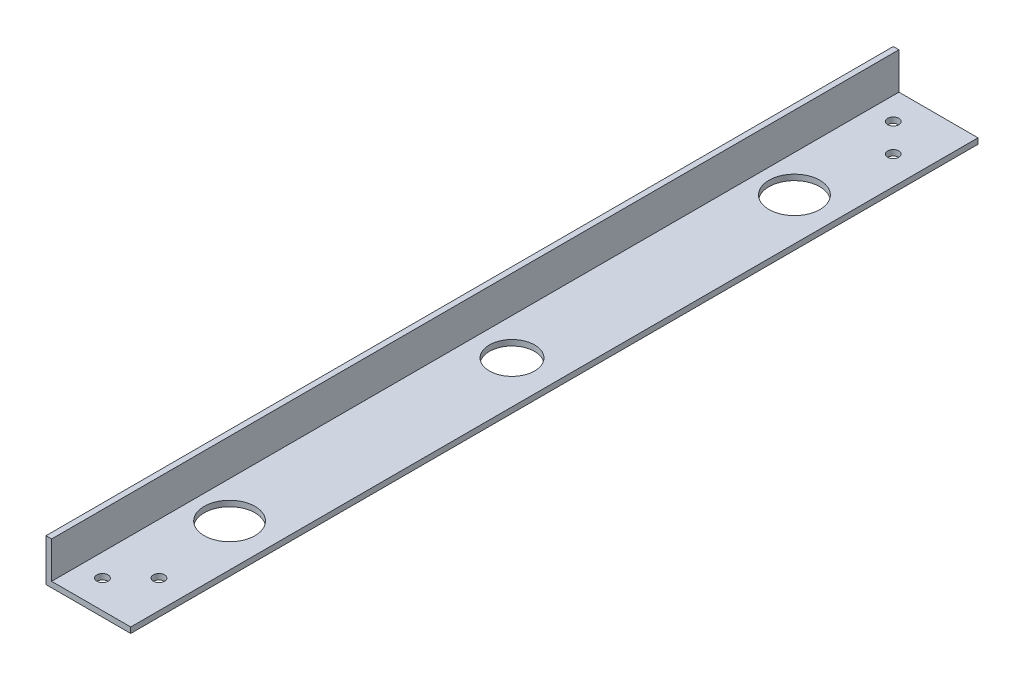
ISO-10303-21;
HEADER;
FILE_DESCRIPTION(('STEP AP214'),'2;1');
FILE_NAME('part.step','',(''),(''),'','','');
FILE_SCHEMA(('AUTOMOTIVE_DESIGN { 1 0 10303 214 1 1 1 1 }'));
ENDSEC;
DATA;
#1=APPLICATION_CONTEXT('core data for automotive mechanical design processes');
#2=APPLICATION_PROTOCOL_DEFINITION('international standard','automotive_design',2000,#1);
#3=PRODUCT_CONTEXT('',#1,'mechanical');
#4=PRODUCT('Part','Part','',(#3));
#5=PRODUCT_RELATED_PRODUCT_CATEGORY('part','',(#4));
#6=PRODUCT_DEFINITION_FORMATION('','',#4);
#7=PRODUCT_DEFINITION_CONTEXT('part definition',#1,'design');
#8=PRODUCT_DEFINITION('design','',#6,#7);
#9=PRODUCT_DEFINITION_SHAPE('','',#8);
#10=(LENGTH_UNIT() NAMED_UNIT(*) SI_UNIT(.MILLI.,.METRE.));
#11=(NAMED_UNIT(*) PLANE_ANGLE_UNIT() SI_UNIT($,.RADIAN.));
#12=(NAMED_UNIT(*) SI_UNIT($,.STERADIAN.) SOLID_ANGLE_UNIT());
#13=UNCERTAINTY_MEASURE_WITH_UNIT(LENGTH_MEASURE(1.E-05),#10,'distance_accuracy_value','');
#14=(GEOMETRIC_REPRESENTATION_CONTEXT(3) GLOBAL_UNCERTAINTY_ASSIGNED_CONTEXT((#13)) GLOBAL_UNIT_ASSIGNED_CONTEXT((#10,
#11,#12)) REPRESENTATION_CONTEXT('',''));
#15=CARTESIAN_POINT('',(0.,0.,0.));
#16=DIRECTION('',(0.,0.,1.));
#17=DIRECTION('',(1.,0.,0.));
#18=AXIS2_PLACEMENT_3D('',#15,#16,#17);
#19=CARTESIAN_POINT('',(30.,0.,300.));
#20=DIRECTION('',(0.,1.,0.));
#21=DIRECTION('',(-1.,0.,0.));
#22=AXIS2_PLACEMENT_3D('',#19,#20,#21);
#23=PLANE('',#22);
#24=CARTESIAN_POINT('',(14.999999999986,0.,50.0000000000007));
#25=DIRECTION('',(0.,-1.,0.));
#26=DIRECTION('',(1.,0.,0.));
#27=AXIS2_PLACEMENT_3D('',#24,#25,#26);
#28=CIRCLE('',#27,9.);
#29=CARTESIAN_POINT('',(23.999999999986,0.,50.0000000000007));
#30=VERTEX_POINT('',#29);
#31=EDGE_CURVE('E145',#30,#30,#28,.T.);
#32=ORIENTED_EDGE('',*,*,#31,.F.);
#33=EDGE_LOOP('',(#32));
#34=FACE_BOUND('',#33,.T.);
#35=CARTESIAN_POINT('',(14.9999999999838,0.,249.999999999999));
#36=DIRECTION('',(0.,-1.,0.));
#37=DIRECTION('',(1.,0.,0.));
#38=AXIS2_PLACEMENT_3D('',#35,#36,#37);
#39=CIRCLE('',#38,9.00000000000001);
#40=CARTESIAN_POINT('',(23.9999999999838,0.,249.999999999999));
#41=VERTEX_POINT('',#40);
#42=EDGE_CURVE('E137',#41,#41,#39,.T.);
#43=ORIENTED_EDGE('',*,*,#42,.F.);
#44=EDGE_LOOP('',(#43));
#45=FACE_BOUND('',#44,.T.);
#46=CARTESIAN_POINT('',(20.,0.,280.));
#47=DIRECTION('',(0.,1.,0.));
#48=DIRECTION('',(-1.,0.,0.));
#49=AXIS2_PLACEMENT_3D('',#46,#47,#48);
#50=CIRCLE('',#49,1.9776934087646);
#51=CARTESIAN_POINT('',(18.0223065912354,0.,280.));
#52=VERTEX_POINT('',#51);
#53=EDGE_CURVE('E152',#52,#52,#50,.T.);
#54=ORIENTED_EDGE('',*,*,#53,.T.);
#55=EDGE_LOOP('',(#54));
#56=FACE_BOUND('',#55,.T.);
#57=CARTESIAN_POINT('',(10.,0.,290.));
#58=DIRECTION('',(0.,1.,0.));
#59=DIRECTION('',(-1.,0.,0.));
#60=AXIS2_PLACEMENT_3D('',#57,#58,#59);
#61=CIRCLE('',#60,1.97769340876459);
#62=CARTESIAN_POINT('',(8.02230659123541,0.,290.));
#63=VERTEX_POINT('',#62);
#64=EDGE_CURVE('E158',#63,#63,#61,.T.);
#65=ORIENTED_EDGE('',*,*,#64,.T.);
#66=EDGE_LOOP('',(#65));
#67=FACE_BOUND('',#66,.T.);
#68=CARTESIAN_POINT('',(20.,0.,20.));
#69=DIRECTION('',(0.,1.,0.));
#70=DIRECTION('',(-1.,0.,0.));
#71=AXIS2_PLACEMENT_3D('',#68,#69,#70);
#72=CIRCLE('',#71,1.9776934087646);
#73=CARTESIAN_POINT('',(18.0223065912354,0.,20.));
#74=VERTEX_POINT('',#73);
#75=EDGE_CURVE('E164',#74,#74,#72,.T.);
#76=ORIENTED_EDGE('',*,*,#75,.T.);
#77=EDGE_LOOP('',(#76));
#78=FACE_BOUND('',#77,.T.);
#79=CARTESIAN_POINT('',(9.99999999999991,0.,10.));
#80=DIRECTION('',(0.,1.,0.));
#81=DIRECTION('',(-1.,0.,0.));
#82=AXIS2_PLACEMENT_3D('',#79,#80,#81);
#83=CIRCLE('',#82,1.9776934087646);
#84=CARTESIAN_POINT('',(8.02230659123532,0.,10.));
#85=VERTEX_POINT('',#84);
#86=EDGE_CURVE('E170',#85,#85,#83,.T.);
#87=ORIENTED_EDGE('',*,*,#86,.T.);
#88=EDGE_LOOP('',(#87));
#89=FACE_BOUND('',#88,.T.);
#90=CARTESIAN_POINT('',(15.,0.,150.));
#91=DIRECTION('',(0.,1.,0.));
#92=DIRECTION('',(-1.,0.,0.));
#93=AXIS2_PLACEMENT_3D('',#90,#91,#92);
#94=CIRCLE('',#93,8.);
#95=CARTESIAN_POINT('',(6.99999999999999,0.,150.));
#96=VERTEX_POINT('',#95);
#97=EDGE_CURVE('E123',#96,#96,#94,.T.);
#98=ORIENTED_EDGE('',*,*,#97,.T.);
#99=EDGE_LOOP('',(#98));
#100=FACE_BOUND('',#99,.T.);
#101=DIRECTION('',(1.,0.,0.));
#102=VECTOR('',#101,1.);
#103=CARTESIAN_POINT('',(30.,0.,0.));
#104=LINE('',#103,#102);
#105=CARTESIAN_POINT('',(0.,0.,0.));
#106=VERTEX_POINT('',#105);
#107=CARTESIAN_POINT('',(30.,0.,0.));
#108=VERTEX_POINT('',#107);
#109=EDGE_CURVE('E119',#106,#108,#104,.T.);
#110=ORIENTED_EDGE('',*,*,#109,.T.);
#111=DIRECTION('',(0.,0.,-1.));
#112=VECTOR('',#111,1.);
#113=CARTESIAN_POINT('',(30.,0.,300.));
#114=LINE('',#113,#112);
#115=CARTESIAN_POINT('',(30.,0.,300.));
#116=VERTEX_POINT('',#115);
#117=EDGE_CURVE('E41',#116,#108,#114,.T.);
#118=ORIENTED_EDGE('',*,*,#117,.F.);
#119=DIRECTION('',(1.,0.,0.));
#120=VECTOR('',#119,1.);
#121=CARTESIAN_POINT('',(30.,0.,300.));
#122=LINE('',#121,#120);
#123=CARTESIAN_POINT('',(0.,0.,300.));
#124=VERTEX_POINT('',#123);
#125=EDGE_CURVE('E129',#124,#116,#122,.T.);
#126=ORIENTED_EDGE('',*,*,#125,.F.);
#127=DIRECTION('',(0.,0.,-1.));
#128=VECTOR('',#127,1.);
#129=CARTESIAN_POINT('',(0.,0.,300.));
#130=LINE('',#129,#128);
#131=EDGE_CURVE('E114',#124,#106,#130,.T.);
#132=ORIENTED_EDGE('',*,*,#131,.T.);
#133=EDGE_LOOP('',(#110,#118,#126,#132));
#134=FACE_BOUND('',#133,.T.);
#135=ADVANCED_FACE('F33',(#34,#45,#56,#67,#78,#89,#100,#134),#23,.F.);
#136=CARTESIAN_POINT('',(30.,2.,300.));
#137=DIRECTION('',(-1.,0.,0.));
#138=DIRECTION('',(0.,0.,1.));
#139=AXIS2_PLACEMENT_3D('',#136,#137,#138);
#140=PLANE('',#139);
#141=DIRECTION('',(0.,1.,0.));
#142=VECTOR('',#141,1.);
#143=CARTESIAN_POINT('',(30.,2.,0.));
#144=LINE('',#143,#142);
#145=CARTESIAN_POINT('',(30.,2.,0.));
#146=VERTEX_POINT('',#145);
#147=EDGE_CURVE('E122',#108,#146,#144,.T.);
#148=ORIENTED_EDGE('',*,*,#147,.T.);
#149=DIRECTION('',(0.,0.,-1.));
#150=VECTOR('',#149,1.);
#151=CARTESIAN_POINT('',(30.,2.,300.));
#152=LINE('',#151,#150);
#153=CARTESIAN_POINT('',(30.,2.,300.));
#154=VERTEX_POINT('',#153);
#155=EDGE_CURVE('E133',#154,#146,#152,.T.);
#156=ORIENTED_EDGE('',*,*,#155,.F.);
#157=DIRECTION('',(0.,1.,0.));
#158=VECTOR('',#157,1.);
#159=CARTESIAN_POINT('',(30.,2.,300.));
#160=LINE('',#159,#158);
#161=EDGE_CURVE('E87',#116,#154,#160,.T.);
#162=ORIENTED_EDGE('',*,*,#161,.F.);
#163=ORIENTED_EDGE('',*,*,#117,.T.);
#164=EDGE_LOOP('',(#148,#156,#162,#163));
#165=FACE_BOUND('',#164,.T.);
#166=ADVANCED_FACE('F180',(#165),#140,.F.);
#167=CARTESIAN_POINT('',(2.,2.,300.));
#168=DIRECTION('',(0.,-1.,0.));
#169=DIRECTION('',(0.,0.,-1.));
#170=AXIS2_PLACEMENT_3D('',#167,#168,#169);
#171=PLANE('',#170);
#172=CARTESIAN_POINT('',(14.999999999986,2.,50.0000000000007));
#173=DIRECTION('',(0.,-1.,0.));
#174=DIRECTION('',(0.,0.,-1.));
#175=AXIS2_PLACEMENT_3D('',#172,#173,#174);
#176=CIRCLE('',#175,9.);
#177=CARTESIAN_POINT('',(14.999999999986,2.,41.0000000000007));
#178=VERTEX_POINT('',#177);
#179=EDGE_CURVE('E36',#178,#178,#176,.T.);
#180=ORIENTED_EDGE('',*,*,#179,.T.);
#181=EDGE_LOOP('',(#180));
#182=FACE_BOUND('',#181,.T.);
#183=CARTESIAN_POINT('',(14.9999999999838,2.,249.999999999999));
#184=DIRECTION('',(0.,-1.,0.));
#185=DIRECTION('',(0.,0.,-1.));
#186=AXIS2_PLACEMENT_3D('',#183,#184,#185);
#187=CIRCLE('',#186,9.00000000000001);
#188=CARTESIAN_POINT('',(14.9999999999838,2.,240.999999999999));
#189=VERTEX_POINT('',#188);
#190=EDGE_CURVE('E107',#189,#189,#187,.T.);
#191=ORIENTED_EDGE('',*,*,#190,.T.);
#192=EDGE_LOOP('',(#191));
#193=FACE_BOUND('',#192,.T.);
#194=CARTESIAN_POINT('',(20.,2.,280.));
#195=DIRECTION('',(0.,1.,0.));
#196=DIRECTION('',(-1.,0.,0.));
#197=AXIS2_PLACEMENT_3D('',#194,#195,#196);
#198=CIRCLE('',#197,1.9776934087646);
#199=CARTESIAN_POINT('',(18.0223065912354,2.,280.));
#200=VERTEX_POINT('',#199);
#201=EDGE_CURVE('E149',#200,#200,#198,.T.);
#202=ORIENTED_EDGE('',*,*,#201,.F.);
#203=EDGE_LOOP('',(#202));
#204=FACE_BOUND('',#203,.T.);
#205=CARTESIAN_POINT('',(10.,2.,290.));
#206=DIRECTION('',(0.,1.,0.));
#207=DIRECTION('',(-1.,0.,0.));
#208=AXIS2_PLACEMENT_3D('',#205,#206,#207);
#209=CIRCLE('',#208,1.97769340876459);
#210=CARTESIAN_POINT('',(8.02230659123541,2.,290.));
#211=VERTEX_POINT('',#210);
#212=EDGE_CURVE('E155',#211,#211,#209,.T.);
#213=ORIENTED_EDGE('',*,*,#212,.F.);
#214=EDGE_LOOP('',(#213));
#215=FACE_BOUND('',#214,.T.);
#216=CARTESIAN_POINT('',(20.,2.,20.));
#217=DIRECTION('',(0.,1.,0.));
#218=DIRECTION('',(-1.,0.,0.));
#219=AXIS2_PLACEMENT_3D('',#216,#217,#218);
#220=CIRCLE('',#219,1.9776934087646);
#221=CARTESIAN_POINT('',(18.0223065912354,2.,20.));
#222=VERTEX_POINT('',#221);
#223=EDGE_CURVE('E161',#222,#222,#220,.T.);
#224=ORIENTED_EDGE('',*,*,#223,.F.);
#225=EDGE_LOOP('',(#224));
#226=FACE_BOUND('',#225,.T.);
#227=CARTESIAN_POINT('',(9.99999999999991,2.,10.));
#228=DIRECTION('',(0.,1.,0.));
#229=DIRECTION('',(-1.,0.,0.));
#230=AXIS2_PLACEMENT_3D('',#227,#228,#229);
#231=CIRCLE('',#230,1.9776934087646);
#232=CARTESIAN_POINT('',(8.02230659123532,2.,10.));
#233=VERTEX_POINT('',#232);
#234=EDGE_CURVE('E167',#233,#233,#231,.T.);
#235=ORIENTED_EDGE('',*,*,#234,.F.);
#236=EDGE_LOOP('',(#235));
#237=FACE_BOUND('',#236,.T.);
#238=CARTESIAN_POINT('',(15.,2.,150.));
#239=DIRECTION('',(0.,1.,0.));
#240=DIRECTION('',(-1.,0.,0.));
#241=AXIS2_PLACEMENT_3D('',#238,#239,#240);
#242=CIRCLE('',#241,8.);
#243=CARTESIAN_POINT('',(6.99999999999999,2.,150.));
#244=VERTEX_POINT('',#243);
#245=EDGE_CURVE('E173',#244,#244,#242,.T.);
#246=ORIENTED_EDGE('',*,*,#245,.F.);
#247=EDGE_LOOP('',(#246));
#248=FACE_BOUND('',#247,.T.);
#249=DIRECTION('',(-1.,0.,0.));
#250=VECTOR('',#249,1.);
#251=CARTESIAN_POINT('',(2.,2.,0.));
#252=LINE('',#251,#250);
#253=CARTESIAN_POINT('',(2.,2.,0.));
#254=VERTEX_POINT('',#253);
#255=EDGE_CURVE('E125',#146,#254,#252,.T.);
#256=ORIENTED_EDGE('',*,*,#255,.T.);
#257=DIRECTION('',(0.,0.,-1.));
#258=VECTOR('',#257,1.);
#259=CARTESIAN_POINT('',(2.,2.,300.));
#260=LINE('',#259,#258);
#261=CARTESIAN_POINT('',(2.,2.,300.));
#262=VERTEX_POINT('',#261);
#263=EDGE_CURVE('E131',#262,#254,#260,.T.);
#264=ORIENTED_EDGE('',*,*,#263,.F.);
#265=DIRECTION('',(-1.,0.,0.));
#266=VECTOR('',#265,1.);
#267=CARTESIAN_POINT('',(2.,2.,300.));
#268=LINE('',#267,#266);
#269=EDGE_CURVE('E111',#154,#262,#268,.T.);
#270=ORIENTED_EDGE('',*,*,#269,.F.);
#271=ORIENTED_EDGE('',*,*,#155,.T.);
#272=EDGE_LOOP('',(#256,#264,#270,#271));
#273=FACE_BOUND('',#272,.T.);
#274=ADVANCED_FACE('F183',(#182,#193,#204,#215,#226,#237,#248,#273),#171,.F.);
#275=CARTESIAN_POINT('',(2.,25.,300.));
#276=DIRECTION('',(-1.,0.,0.));
#277=DIRECTION('',(0.,-1.,0.));
#278=AXIS2_PLACEMENT_3D('',#275,#276,#277);
#279=PLANE('',#278);
#280=DIRECTION('',(0.,1.,0.));
#281=VECTOR('',#280,1.);
#282=CARTESIAN_POINT('',(2.,25.,0.));
#283=LINE('',#282,#281);
#284=CARTESIAN_POINT('',(2.,15.,0.));
#285=VERTEX_POINT('',#284);
#286=EDGE_CURVE('E106',#254,#285,#283,.T.);
#287=ORIENTED_EDGE('',*,*,#286,.T.);
#288=DIRECTION('',(0.,0.,-1.));
#289=VECTOR('',#288,1.);
#290=CARTESIAN_POINT('',(2.,15.,300.));
#291=LINE('',#290,#289);
#292=CARTESIAN_POINT('',(2.,15.,300.));
#293=VERTEX_POINT('',#292);
#294=EDGE_CURVE('E48',#293,#285,#291,.T.);
#295=ORIENTED_EDGE('',*,*,#294,.F.);
#296=DIRECTION('',(0.,1.,0.));
#297=VECTOR('',#296,1.);
#298=CARTESIAN_POINT('',(2.,25.,300.));
#299=LINE('',#298,#297);
#300=EDGE_CURVE('E104',#262,#293,#299,.T.);
#301=ORIENTED_EDGE('',*,*,#300,.F.);
#302=ORIENTED_EDGE('',*,*,#263,.T.);
#303=EDGE_LOOP('',(#287,#295,#301,#302));
#304=FACE_BOUND('',#303,.T.);
#305=ADVANCED_FACE('F102',(#304),#279,.F.);
#306=CARTESIAN_POINT('',(0.,0.,300.));
#307=DIRECTION('',(1.,0.,0.));
#308=DIRECTION('',(0.,0.,-1.));
#309=AXIS2_PLACEMENT_3D('',#306,#307,#308);
#310=PLANE('',#309);
#311=DIRECTION('',(0.,-1.,0.));
#312=VECTOR('',#311,1.);
#313=CARTESIAN_POINT('',(0.,0.,300.));
#314=LINE('',#313,#312);
#315=CARTESIAN_POINT('',(0.,15.,300.));
#316=VERTEX_POINT('',#315);
#317=EDGE_CURVE('E57',#316,#124,#314,.T.);
#318=ORIENTED_EDGE('',*,*,#317,.F.);
#319=DIRECTION('',(0.,0.,-1.));
#320=VECTOR('',#319,1.);
#321=CARTESIAN_POINT('',(0.,15.,300.));
#322=LINE('',#321,#320);
#323=CARTESIAN_POINT('',(0.,15.,0.));
#324=VERTEX_POINT('',#323);
#325=EDGE_CURVE('E96',#316,#324,#322,.T.);
#326=ORIENTED_EDGE('',*,*,#325,.T.);
#327=DIRECTION('',(0.,-1.,0.));
#328=VECTOR('',#327,1.);
#329=CARTESIAN_POINT('',(0.,0.,0.));
#330=LINE('',#329,#328);
#331=EDGE_CURVE('E79',#324,#106,#330,.T.);
#332=ORIENTED_EDGE('',*,*,#331,.T.);
#333=ORIENTED_EDGE('',*,*,#131,.F.);
#334=EDGE_LOOP('',(#318,#326,#332,#333));
#335=FACE_BOUND('',#334,.T.);
#336=ADVANCED_FACE('F187',(#335),#310,.F.);
#337=CARTESIAN_POINT('',(0.,0.,300.));
#338=DIRECTION('',(0.,0.,-1.));
#339=DIRECTION('',(-1.,0.,0.));
#340=AXIS2_PLACEMENT_3D('',#337,#338,#339);
#341=PLANE('',#340);
#342=ORIENTED_EDGE('',*,*,#300,.T.);
#343=DIRECTION('',(1.,0.,0.));
#344=VECTOR('',#343,1.);
#345=CARTESIAN_POINT('',(-8.,15.,300.));
#346=LINE('',#345,#344);
#347=EDGE_CURVE('E94',#316,#293,#346,.T.);
#348=ORIENTED_EDGE('',*,*,#347,.F.);
#349=ORIENTED_EDGE('',*,*,#317,.T.);
#350=ORIENTED_EDGE('',*,*,#125,.T.);
#351=ORIENTED_EDGE('',*,*,#161,.T.);
#352=ORIENTED_EDGE('',*,*,#269,.T.);
#353=EDGE_LOOP('',(#342,#348,#349,#350,#351,#352));
#354=FACE_BOUND('',#353,.T.);
#355=ADVANCED_FACE('F109',(#354),#341,.F.);
#356=CARTESIAN_POINT('',(0.,0.,0.));
#357=DIRECTION('',(0.,0.,-1.));
#358=DIRECTION('',(-1.,0.,0.));
#359=AXIS2_PLACEMENT_3D('',#356,#357,#358);
#360=PLANE('',#359);
#361=DIRECTION('',(-1.,0.,0.));
#362=VECTOR('',#361,1.);
#363=CARTESIAN_POINT('',(0.,15.,0.));
#364=LINE('',#363,#362);
#365=EDGE_CURVE('E11',#285,#324,#364,.T.);
#366=ORIENTED_EDGE('',*,*,#365,.F.);
#367=ORIENTED_EDGE('',*,*,#286,.F.);
#368=ORIENTED_EDGE('',*,*,#255,.F.);
#369=ORIENTED_EDGE('',*,*,#147,.F.);
#370=ORIENTED_EDGE('',*,*,#109,.F.);
#371=ORIENTED_EDGE('',*,*,#331,.F.);
#372=EDGE_LOOP('',(#366,#367,#368,#369,#370,#371));
#373=FACE_BOUND('',#372,.T.);
#374=ADVANCED_FACE('F185',(#373),#360,.T.);
#375=CARTESIAN_POINT('',(15.,-8.,150.));
#376=DIRECTION('',(0.,1.,0.));
#377=DIRECTION('',(-1.,0.,0.));
#378=AXIS2_PLACEMENT_3D('',#375,#376,#377);
#379=CYLINDRICAL_SURFACE('',#378,8.);
#380=ORIENTED_EDGE('',*,*,#245,.T.);
#381=EDGE_LOOP('',(#380));
#382=FACE_BOUND('',#381,.T.);
#383=ORIENTED_EDGE('',*,*,#97,.F.);
#384=EDGE_LOOP('',(#383));
#385=FACE_BOUND('',#384,.T.);
#386=ADVANCED_FACE('F208',(#382,#385),#379,.F.);
#387=CARTESIAN_POINT('',(9.99999999999991,-8.,10.));
#388=DIRECTION('',(0.,1.,0.));
#389=DIRECTION('',(-1.,0.,0.));
#390=AXIS2_PLACEMENT_3D('',#387,#388,#389);
#391=CYLINDRICAL_SURFACE('',#390,1.9776934087646);
#392=ORIENTED_EDGE('',*,*,#234,.T.);
#393=EDGE_LOOP('',(#392));
#394=FACE_BOUND('',#393,.T.);
#395=ORIENTED_EDGE('',*,*,#86,.F.);
#396=EDGE_LOOP('',(#395));
#397=FACE_BOUND('',#396,.T.);
#398=ADVANCED_FACE('F210',(#394,#397),#391,.F.);
#399=CARTESIAN_POINT('',(20.,-8.,20.));
#400=DIRECTION('',(0.,1.,0.));
#401=DIRECTION('',(-1.,0.,0.));
#402=AXIS2_PLACEMENT_3D('',#399,#400,#401);
#403=CYLINDRICAL_SURFACE('',#402,1.9776934087646);
#404=ORIENTED_EDGE('',*,*,#223,.T.);
#405=EDGE_LOOP('',(#404));
#406=FACE_BOUND('',#405,.T.);
#407=ORIENTED_EDGE('',*,*,#75,.F.);
#408=EDGE_LOOP('',(#407));
#409=FACE_BOUND('',#408,.T.);
#410=ADVANCED_FACE('F217',(#406,#409),#403,.F.);
#411=CARTESIAN_POINT('',(10.,-8.,290.));
#412=DIRECTION('',(0.,1.,0.));
#413=DIRECTION('',(-1.,0.,0.));
#414=AXIS2_PLACEMENT_3D('',#411,#412,#413);
#415=CYLINDRICAL_SURFACE('',#414,1.97769340876459);
#416=ORIENTED_EDGE('',*,*,#212,.T.);
#417=EDGE_LOOP('',(#416));
#418=FACE_BOUND('',#417,.T.);
#419=ORIENTED_EDGE('',*,*,#64,.F.);
#420=EDGE_LOOP('',(#419));
#421=FACE_BOUND('',#420,.T.);
#422=ADVANCED_FACE('F248',(#418,#421),#415,.F.);
#423=CARTESIAN_POINT('',(20.,-8.,280.));
#424=DIRECTION('',(0.,1.,0.));
#425=DIRECTION('',(-1.,0.,0.));
#426=AXIS2_PLACEMENT_3D('',#423,#424,#425);
#427=CYLINDRICAL_SURFACE('',#426,1.9776934087646);
#428=ORIENTED_EDGE('',*,*,#201,.T.);
#429=EDGE_LOOP('',(#428));
#430=FACE_BOUND('',#429,.T.);
#431=ORIENTED_EDGE('',*,*,#53,.F.);
#432=EDGE_LOOP('',(#431));
#433=FACE_BOUND('',#432,.T.);
#434=ADVANCED_FACE('F252',(#430,#433),#427,.F.);
#435=CARTESIAN_POINT('',(-8.,15.,300.));
#436=DIRECTION('',(0.,-1.,0.));
#437=DIRECTION('',(1.,0.,0.));
#438=AXIS2_PLACEMENT_3D('',#435,#436,#437);
#439=PLANE('',#438);
#440=ORIENTED_EDGE('',*,*,#347,.T.);
#441=ORIENTED_EDGE('',*,*,#294,.T.);
#442=ORIENTED_EDGE('',*,*,#365,.T.);
#443=ORIENTED_EDGE('',*,*,#325,.F.);
#444=EDGE_LOOP('',(#440,#441,#442,#443));
#445=FACE_BOUND('',#444,.T.);
#446=ADVANCED_FACE('F95',(#445),#439,.F.);
#447=CARTESIAN_POINT('',(14.9999999999838,5.,249.999999999999));
#448=DIRECTION('',(0.,-1.,0.));
#449=DIRECTION('',(1.,0.,0.));
#450=AXIS2_PLACEMENT_3D('',#447,#448,#449);
#451=CYLINDRICAL_SURFACE('',#450,9.00000000000001);
#452=ORIENTED_EDGE('',*,*,#42,.T.);
#453=EDGE_LOOP('',(#452));
#454=FACE_BOUND('',#453,.T.);
#455=ORIENTED_EDGE('',*,*,#190,.F.);
#456=EDGE_LOOP('',(#455));
#457=FACE_BOUND('',#456,.T.);
#458=ADVANCED_FACE('F261',(#454,#457),#451,.F.);
#459=CARTESIAN_POINT('',(14.999999999986,5.,50.0000000000007));
#460=DIRECTION('',(0.,-1.,0.));
#461=DIRECTION('',(1.,0.,0.));
#462=AXIS2_PLACEMENT_3D('',#459,#460,#461);
#463=CYLINDRICAL_SURFACE('',#462,9.);
#464=ORIENTED_EDGE('',*,*,#31,.T.);
#465=EDGE_LOOP('',(#464));
#466=FACE_BOUND('',#465,.T.);
#467=ORIENTED_EDGE('',*,*,#179,.F.);
#468=EDGE_LOOP('',(#467));
#469=FACE_BOUND('',#468,.T.);
#470=ADVANCED_FACE('F264',(#466,#469),#463,.F.);
#471=CLOSED_SHELL('',(#135,#166,#274,#305,#336,#355,#374,#386,#398,#410,#422,#434,#446,#458,#470));
#472=MANIFOLD_SOLID_BREP('B2',#471);
#473=ADVANCED_BREP_SHAPE_REPRESENTATION('',(#18,#472),#14);
#474=SHAPE_DEFINITION_REPRESENTATION(#9,#473);
ENDSEC;
END-ISO-10303-21;
